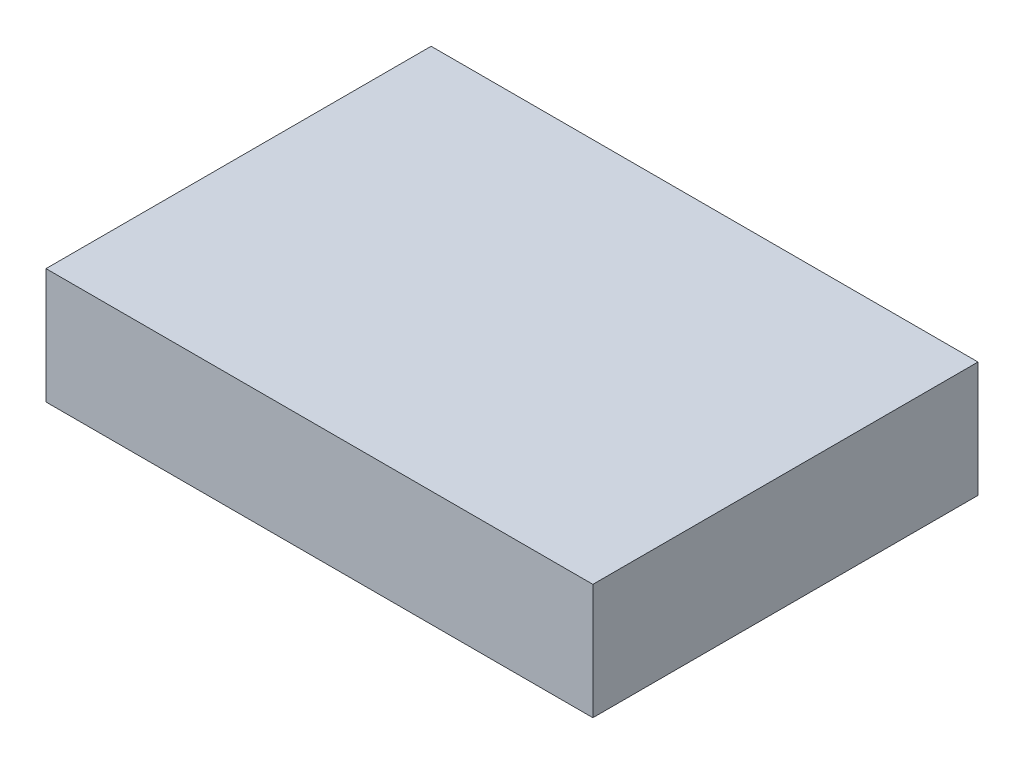
ISO-10303-21;
HEADER;
FILE_DESCRIPTION(('STEP AP214'),'2;1');
FILE_NAME('part.step','',(''),(''),'','','');
FILE_SCHEMA(('AUTOMOTIVE_DESIGN { 1 0 10303 214 1 1 1 1 }'));
ENDSEC;
DATA;
#1=APPLICATION_CONTEXT('core data for automotive mechanical design processes');
#2=APPLICATION_PROTOCOL_DEFINITION('international standard','automotive_design',2000,#1);
#3=PRODUCT_CONTEXT('',#1,'mechanical');
#4=PRODUCT('Part','Part','',(#3));
#5=PRODUCT_RELATED_PRODUCT_CATEGORY('part','',(#4));
#6=PRODUCT_DEFINITION_FORMATION('','',#4);
#7=PRODUCT_DEFINITION_CONTEXT('part definition',#1,'design');
#8=PRODUCT_DEFINITION('design','',#6,#7);
#9=PRODUCT_DEFINITION_SHAPE('','',#8);
#10=(LENGTH_UNIT() NAMED_UNIT(*) SI_UNIT(.MILLI.,.METRE.));
#11=(NAMED_UNIT(*) PLANE_ANGLE_UNIT() SI_UNIT($,.RADIAN.));
#12=(NAMED_UNIT(*) SI_UNIT($,.STERADIAN.) SOLID_ANGLE_UNIT());
#13=UNCERTAINTY_MEASURE_WITH_UNIT(LENGTH_MEASURE(1.E-05),#10,'distance_accuracy_value','');
#14=(GEOMETRIC_REPRESENTATION_CONTEXT(3) GLOBAL_UNCERTAINTY_ASSIGNED_CONTEXT((#13)) GLOBAL_UNIT_ASSIGNED_CONTEXT((#10,
#11,#12)) REPRESENTATION_CONTEXT('',''));
#15=CARTESIAN_POINT('',(0.,0.,0.));
#16=DIRECTION('',(0.,0.,1.));
#17=DIRECTION('',(1.,0.,0.));
#18=AXIS2_PLACEMENT_3D('',#15,#16,#17);
#19=CARTESIAN_POINT('',(0.,15.,0.));
#20=DIRECTION('',(1.,0.,0.));
#21=DIRECTION('',(0.,0.,-1.));
#22=AXIS2_PLACEMENT_3D('',#19,#20,#21);
#23=PLANE('',#22);
#24=DIRECTION('',(0.,0.,1.));
#25=VECTOR('',#24,1.);
#26=CARTESIAN_POINT('',(0.,0.,0.));
#27=LINE('',#26,#25);
#28=CARTESIAN_POINT('',(0.,0.,0.));
#29=VERTEX_POINT('',#28);
#30=CARTESIAN_POINT('',(0.,0.,50.));
#31=VERTEX_POINT('',#30);
#32=EDGE_CURVE('E104',#29,#31,#27,.T.);
#33=ORIENTED_EDGE('',*,*,#32,.T.);
#34=DIRECTION('',(0.,-1.,0.));
#35=VECTOR('',#34,1.);
#36=CARTESIAN_POINT('',(0.,15.,50.));
#37=LINE('',#36,#35);
#38=CARTESIAN_POINT('',(0.,15.,50.));
#39=VERTEX_POINT('',#38);
#40=EDGE_CURVE('E11',#39,#31,#37,.T.);
#41=ORIENTED_EDGE('',*,*,#40,.F.);
#42=DIRECTION('',(0.,0.,1.));
#43=VECTOR('',#42,1.);
#44=CARTESIAN_POINT('',(0.,15.,0.));
#45=LINE('',#44,#43);
#46=CARTESIAN_POINT('',(0.,15.,0.));
#47=VERTEX_POINT('',#46);
#48=EDGE_CURVE('E92',#47,#39,#45,.T.);
#49=ORIENTED_EDGE('',*,*,#48,.F.);
#50=DIRECTION('',(0.,-1.,0.));
#51=VECTOR('',#50,1.);
#52=CARTESIAN_POINT('',(0.,15.,0.));
#53=LINE('',#52,#51);
#54=EDGE_CURVE('E100',#47,#29,#53,.T.);
#55=ORIENTED_EDGE('',*,*,#54,.T.);
#56=EDGE_LOOP('',(#33,#41,#49,#55));
#57=FACE_BOUND('',#56,.T.);
#58=ADVANCED_FACE('F41',(#57),#23,.F.);
#59=CARTESIAN_POINT('',(0.,15.,50.));
#60=DIRECTION('',(0.,0.,-1.));
#61=DIRECTION('',(-1.,0.,0.));
#62=AXIS2_PLACEMENT_3D('',#59,#60,#61);
#63=PLANE('',#62);
#64=DIRECTION('',(1.,0.,0.));
#65=VECTOR('',#64,1.);
#66=CARTESIAN_POINT('',(0.,0.,50.));
#67=LINE('',#66,#65);
#68=CARTESIAN_POINT('',(71.,0.,50.));
#69=VERTEX_POINT('',#68);
#70=EDGE_CURVE('E96',#31,#69,#67,.T.);
#71=ORIENTED_EDGE('',*,*,#70,.T.);
#72=DIRECTION('',(0.,-1.,0.));
#73=VECTOR('',#72,1.);
#74=CARTESIAN_POINT('',(71.,15.,50.));
#75=LINE('',#74,#73);
#76=CARTESIAN_POINT('',(71.,15.,50.));
#77=VERTEX_POINT('',#76);
#78=EDGE_CURVE('E49',#77,#69,#75,.T.);
#79=ORIENTED_EDGE('',*,*,#78,.F.);
#80=DIRECTION('',(1.,0.,0.));
#81=VECTOR('',#80,1.);
#82=CARTESIAN_POINT('',(0.,15.,50.));
#83=LINE('',#82,#81);
#84=EDGE_CURVE('E87',#39,#77,#83,.T.);
#85=ORIENTED_EDGE('',*,*,#84,.F.);
#86=ORIENTED_EDGE('',*,*,#40,.T.);
#87=EDGE_LOOP('',(#71,#79,#85,#86));
#88=FACE_BOUND('',#87,.T.);
#89=ADVANCED_FACE('F95',(#88),#63,.F.);
#90=CARTESIAN_POINT('',(71.,15.,0.));
#91=DIRECTION('',(-1.,0.,0.));
#92=DIRECTION('',(0.,0.,1.));
#93=AXIS2_PLACEMENT_3D('',#90,#91,#92);
#94=PLANE('',#93);
#95=DIRECTION('',(0.,0.,-1.));
#96=VECTOR('',#95,1.);
#97=CARTESIAN_POINT('',(71.,0.,0.));
#98=LINE('',#97,#96);
#99=CARTESIAN_POINT('',(71.,0.,0.));
#100=VERTEX_POINT('',#99);
#101=EDGE_CURVE('E74',#69,#100,#98,.T.);
#102=ORIENTED_EDGE('',*,*,#101,.T.);
#103=DIRECTION('',(0.,-1.,0.));
#104=VECTOR('',#103,1.);
#105=CARTESIAN_POINT('',(71.,15.,0.));
#106=LINE('',#105,#104);
#107=CARTESIAN_POINT('',(71.,15.,0.));
#108=VERTEX_POINT('',#107);
#109=EDGE_CURVE('E97',#108,#100,#106,.T.);
#110=ORIENTED_EDGE('',*,*,#109,.F.);
#111=DIRECTION('',(0.,0.,-1.));
#112=VECTOR('',#111,1.);
#113=CARTESIAN_POINT('',(71.,15.,0.));
#114=LINE('',#113,#112);
#115=EDGE_CURVE('E90',#77,#108,#114,.T.);
#116=ORIENTED_EDGE('',*,*,#115,.F.);
#117=ORIENTED_EDGE('',*,*,#78,.T.);
#118=EDGE_LOOP('',(#102,#110,#116,#117));
#119=FACE_BOUND('',#118,.T.);
#120=ADVANCED_FACE('F98',(#119),#94,.F.);
#121=CARTESIAN_POINT('',(0.,15.,0.));
#122=DIRECTION('',(0.,0.,1.));
#123=DIRECTION('',(1.,0.,0.));
#124=AXIS2_PLACEMENT_3D('',#121,#122,#123);
#125=PLANE('',#124);
#126=DIRECTION('',(-1.,0.,0.));
#127=VECTOR('',#126,1.);
#128=CARTESIAN_POINT('',(0.,0.,0.));
#129=LINE('',#128,#127);
#130=EDGE_CURVE('E80',#100,#29,#129,.T.);
#131=ORIENTED_EDGE('',*,*,#130,.T.);
#132=ORIENTED_EDGE('',*,*,#54,.F.);
#133=DIRECTION('',(-1.,0.,0.));
#134=VECTOR('',#133,1.);
#135=CARTESIAN_POINT('',(0.,15.,0.));
#136=LINE('',#135,#134);
#137=EDGE_CURVE('E57',#108,#47,#136,.T.);
#138=ORIENTED_EDGE('',*,*,#137,.F.);
#139=ORIENTED_EDGE('',*,*,#109,.T.);
#140=EDGE_LOOP('',(#131,#132,#138,#139));
#141=FACE_BOUND('',#140,.T.);
#142=ADVANCED_FACE('F111',(#141),#125,.F.);
#143=CARTESIAN_POINT('',(0.,15.,0.));
#144=DIRECTION('',(0.,1.,0.));
#145=DIRECTION('',(0.,0.,1.));
#146=AXIS2_PLACEMENT_3D('',#143,#144,#145);
#147=PLANE('',#146);
#148=ORIENTED_EDGE('',*,*,#48,.T.);
#149=ORIENTED_EDGE('',*,*,#84,.T.);
#150=ORIENTED_EDGE('',*,*,#115,.T.);
#151=ORIENTED_EDGE('',*,*,#137,.T.);
#152=EDGE_LOOP('',(#148,#149,#150,#151));
#153=FACE_BOUND('',#152,.T.);
#154=ADVANCED_FACE('F88',(#153),#147,.T.);
#155=CARTESIAN_POINT('',(0.,0.,0.));
#156=DIRECTION('',(0.,1.,0.));
#157=DIRECTION('',(0.,0.,1.));
#158=AXIS2_PLACEMENT_3D('',#155,#156,#157);
#159=PLANE('',#158);
#160=ORIENTED_EDGE('',*,*,#32,.F.);
#161=ORIENTED_EDGE('',*,*,#130,.F.);
#162=ORIENTED_EDGE('',*,*,#101,.F.);
#163=ORIENTED_EDGE('',*,*,#70,.F.);
#164=EDGE_LOOP('',(#160,#161,#162,#163));
#165=FACE_BOUND('',#164,.T.);
#166=ADVANCED_FACE('F114',(#165),#159,.F.);
#167=CLOSED_SHELL('',(#58,#89,#120,#142,#154,#166));
#168=MANIFOLD_SOLID_BREP('B2',#167);
#169=ADVANCED_BREP_SHAPE_REPRESENTATION('',(#18,#168),#14);
#170=SHAPE_DEFINITION_REPRESENTATION(#9,#169);
ENDSEC;
END-ISO-10303-21;
